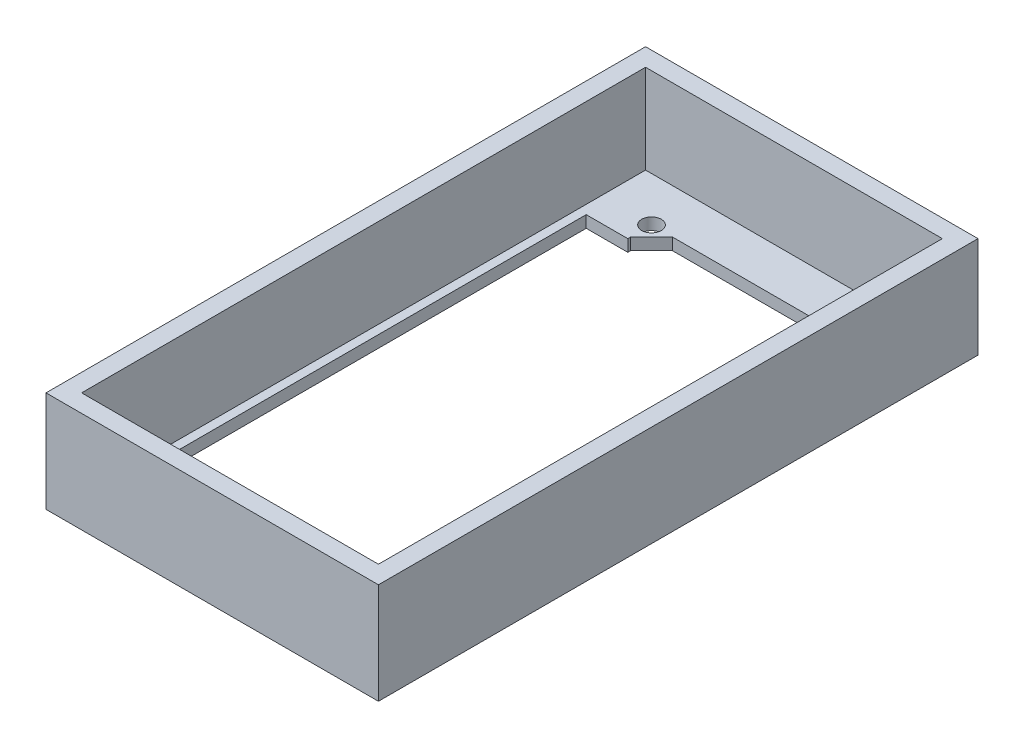
ISO-10303-21;
HEADER;
FILE_DESCRIPTION(('STEP AP214'),'2;1');
FILE_NAME('part.step','',(''),(''),'','','');
FILE_SCHEMA(('AUTOMOTIVE_DESIGN { 1 0 10303 214 1 1 1 1 }'));
ENDSEC;
DATA;
#1=APPLICATION_CONTEXT('core data for automotive mechanical design processes');
#2=APPLICATION_PROTOCOL_DEFINITION('international standard','automotive_design',2000,#1);
#3=PRODUCT_CONTEXT('',#1,'mechanical');
#4=PRODUCT('Part','Part','',(#3));
#5=PRODUCT_RELATED_PRODUCT_CATEGORY('part','',(#4));
#6=PRODUCT_DEFINITION_FORMATION('','',#4);
#7=PRODUCT_DEFINITION_CONTEXT('part definition',#1,'design');
#8=PRODUCT_DEFINITION('design','',#6,#7);
#9=PRODUCT_DEFINITION_SHAPE('','',#8);
#10=(LENGTH_UNIT() NAMED_UNIT(*) SI_UNIT(.MILLI.,.METRE.));
#11=(NAMED_UNIT(*) PLANE_ANGLE_UNIT() SI_UNIT($,.RADIAN.));
#12=(NAMED_UNIT(*) SI_UNIT($,.STERADIAN.) SOLID_ANGLE_UNIT());
#13=UNCERTAINTY_MEASURE_WITH_UNIT(LENGTH_MEASURE(1.E-05),#10,'distance_accuracy_value','');
#14=(GEOMETRIC_REPRESENTATION_CONTEXT(3) GLOBAL_UNCERTAINTY_ASSIGNED_CONTEXT((#13)) GLOBAL_UNIT_ASSIGNED_CONTEXT((#10,
#11,#12)) REPRESENTATION_CONTEXT('',''));
#15=CARTESIAN_POINT('',(0.,0.,0.));
#16=DIRECTION('',(0.,0.,1.));
#17=DIRECTION('',(1.,0.,0.));
#18=AXIS2_PLACEMENT_3D('',#15,#16,#17);
#19=CARTESIAN_POINT('',(-16.5,2.,-36.4644660940673));
#20=DIRECTION('',(1.,0.,0.));
#21=DIRECTION('',(0.,0.,-1.));
#22=AXIS2_PLACEMENT_3D('',#19,#20,#21);
#23=PLANE('',#22);
#24=DIRECTION('',(0.,1.,0.));
#25=VECTOR('',#24,1.);
#26=CARTESIAN_POINT('',(-16.5,0.,-36.));
#27=LINE('',#26,#25);
#28=CARTESIAN_POINT('',(-16.5,0.,-36.));
#29=VERTEX_POINT('',#28);
#30=CARTESIAN_POINT('',(-16.5,2.,-36.));
#31=VERTEX_POINT('',#30);
#32=EDGE_CURVE('E206',#29,#31,#27,.T.);
#33=ORIENTED_EDGE('',*,*,#32,.F.);
#34=DIRECTION('',(0.,0.,1.));
#35=VECTOR('',#34,1.);
#36=CARTESIAN_POINT('',(-16.5,0.,-36.4644660940673));
#37=LINE('',#36,#35);
#38=CARTESIAN_POINT('',(-16.5,0.,-36.4644660940673));
#39=VERTEX_POINT('',#38);
#40=EDGE_CURVE('E198',#39,#29,#37,.T.);
#41=ORIENTED_EDGE('',*,*,#40,.F.);
#42=DIRECTION('',(0.,-1.,0.));
#43=VECTOR('',#42,1.);
#44=CARTESIAN_POINT('',(-16.5,2.,-36.4644660940673));
#45=LINE('',#44,#43);
#46=CARTESIAN_POINT('',(-16.5,2.,-36.4644660940673));
#47=VERTEX_POINT('',#46);
#48=EDGE_CURVE('E296',#47,#39,#45,.T.);
#49=ORIENTED_EDGE('',*,*,#48,.F.);
#50=DIRECTION('',(0.,0.,1.));
#51=VECTOR('',#50,1.);
#52=CARTESIAN_POINT('',(-16.5,2.,-36.4644660940673));
#53=LINE('',#52,#51);
#54=EDGE_CURVE('E269',#47,#31,#53,.T.);
#55=ORIENTED_EDGE('',*,*,#54,.T.);
#56=EDGE_LOOP('',(#33,#41,#49,#55));
#57=FACE_BOUND('',#56,.T.);
#58=ADVANCED_FACE('F35',(#57),#23,.T.);
#59=CARTESIAN_POINT('',(0.,2.,0.));
#60=DIRECTION('',(0.,-1.,0.));
#61=DIRECTION('',(0.,0.,-1.));
#62=AXIS2_PLACEMENT_3D('',#59,#60,#61);
#63=PLANE('',#62);
#64=DIRECTION('',(0.,0.,-1.));
#65=VECTOR('',#64,1.);
#66=CARTESIAN_POINT('',(25.,2.,47.5));
#67=LINE('',#66,#65);
#68=CARTESIAN_POINT('',(25.,2.,47.5));
#69=VERTEX_POINT('',#68);
#70=CARTESIAN_POINT('',(25.,2.,-47.5));
#71=VERTEX_POINT('',#70);
#72=EDGE_CURVE('E215',#69,#71,#67,.T.);
#73=ORIENTED_EDGE('',*,*,#72,.T.);
#74=DIRECTION('',(-1.,0.,0.));
#75=VECTOR('',#74,1.);
#76=CARTESIAN_POINT('',(25.,2.,-47.5));
#77=LINE('',#76,#75);
#78=CARTESIAN_POINT('',(-25.,2.,-47.5));
#79=VERTEX_POINT('',#78);
#80=EDGE_CURVE('E208',#71,#79,#77,.T.);
#81=ORIENTED_EDGE('',*,*,#80,.T.);
#82=DIRECTION('',(0.,0.,1.));
#83=VECTOR('',#82,1.);
#84=CARTESIAN_POINT('',(-25.,2.,-47.5));
#85=LINE('',#84,#83);
#86=CARTESIAN_POINT('',(-25.,2.,47.5));
#87=VERTEX_POINT('',#86);
#88=EDGE_CURVE('E224',#79,#87,#85,.T.);
#89=ORIENTED_EDGE('',*,*,#88,.T.);
#90=DIRECTION('',(1.,0.,0.));
#91=VECTOR('',#90,1.);
#92=CARTESIAN_POINT('',(-25.,2.,47.5));
#93=LINE('',#92,#91);
#94=EDGE_CURVE('E227',#87,#69,#93,.T.);
#95=ORIENTED_EDGE('',*,*,#94,.T.);
#96=EDGE_LOOP('',(#73,#81,#89,#95));
#97=FACE_BOUND('',#96,.T.);
#98=CARTESIAN_POINT('',(16.5,2.,40.));
#99=DIRECTION('',(0.,1.,0.));
#100=DIRECTION('',(0.,0.,1.));
#101=AXIS2_PLACEMENT_3D('',#98,#99,#100);
#102=CIRCLE('',#101,1.65);
#103=CARTESIAN_POINT('',(16.5,2.,41.65));
#104=VERTEX_POINT('',#103);
#105=EDGE_CURVE('E312',#104,#104,#102,.T.);
#106=ORIENTED_EDGE('',*,*,#105,.F.);
#107=EDGE_LOOP('',(#106));
#108=FACE_BOUND('',#107,.T.);
#109=CARTESIAN_POINT('',(-16.5,2.,40.));
#110=DIRECTION('',(0.,1.,0.));
#111=DIRECTION('',(0.,0.,1.));
#112=AXIS2_PLACEMENT_3D('',#109,#110,#111);
#113=CIRCLE('',#112,1.65);
#114=CARTESIAN_POINT('',(-16.5,2.,41.65));
#115=VERTEX_POINT('',#114);
#116=EDGE_CURVE('E318',#115,#115,#113,.T.);
#117=ORIENTED_EDGE('',*,*,#116,.F.);
#118=EDGE_LOOP('',(#117));
#119=FACE_BOUND('',#118,.T.);
#120=CARTESIAN_POINT('',(16.5,2.,-40.));
#121=DIRECTION('',(0.,1.,0.));
#122=DIRECTION('',(0.,0.,1.));
#123=AXIS2_PLACEMENT_3D('',#120,#121,#122);
#124=CIRCLE('',#123,1.65);
#125=CARTESIAN_POINT('',(16.5,2.,-38.35));
#126=VERTEX_POINT('',#125);
#127=EDGE_CURVE('E324',#126,#126,#124,.T.);
#128=ORIENTED_EDGE('',*,*,#127,.F.);
#129=EDGE_LOOP('',(#128));
#130=FACE_BOUND('',#129,.T.);
#131=CARTESIAN_POINT('',(-16.5,2.,-40.));
#132=DIRECTION('',(0.,1.,0.));
#133=DIRECTION('',(0.,0.,1.));
#134=AXIS2_PLACEMENT_3D('',#131,#132,#133);
#135=CIRCLE('',#134,1.65);
#136=CARTESIAN_POINT('',(-16.5,2.,-38.35));
#137=VERTEX_POINT('',#136);
#138=EDGE_CURVE('E330',#137,#137,#135,.T.);
#139=ORIENTED_EDGE('',*,*,#138,.F.);
#140=EDGE_LOOP('',(#139));
#141=FACE_BOUND('',#140,.T.);
#142=DIRECTION('',(0.,0.,1.));
#143=VECTOR('',#142,1.);
#144=CARTESIAN_POINT('',(-23.5,2.,-36.));
#145=LINE('',#144,#143);
#146=CARTESIAN_POINT('',(-23.5,2.,-36.));
#147=VERTEX_POINT('',#146);
#148=CARTESIAN_POINT('',(-23.5,2.,36.));
#149=VERTEX_POINT('',#148);
#150=EDGE_CURVE('E200',#147,#149,#145,.T.);
#151=ORIENTED_EDGE('',*,*,#150,.F.);
#152=DIRECTION('',(-1.,0.,0.));
#153=VECTOR('',#152,1.);
#154=CARTESIAN_POINT('',(-16.5,2.,-36.));
#155=LINE('',#154,#153);
#156=EDGE_CURVE('E179',#31,#147,#155,.T.);
#157=ORIENTED_EDGE('',*,*,#156,.F.);
#158=ORIENTED_EDGE('',*,*,#54,.F.);
#159=DIRECTION('',(-0.707106781186548,0.,0.707106781186547));
#160=VECTOR('',#159,1.);
#161=CARTESIAN_POINT('',(-16.5,2.,-36.4644660940673));
#162=LINE('',#161,#160);
#163=CARTESIAN_POINT('',(-12.9644660940673,2.,-40.));
#164=VERTEX_POINT('',#163);
#165=EDGE_CURVE('E265',#164,#47,#162,.T.);
#166=ORIENTED_EDGE('',*,*,#165,.F.);
#167=DIRECTION('',(-1.,0.,0.));
#168=VECTOR('',#167,1.);
#169=CARTESIAN_POINT('',(-12.9644660940673,2.,-40.));
#170=LINE('',#169,#168);
#171=CARTESIAN_POINT('',(12.9644660940673,2.,-40.));
#172=VERTEX_POINT('',#171);
#173=EDGE_CURVE('E263',#172,#164,#170,.T.);
#174=ORIENTED_EDGE('',*,*,#173,.F.);
#175=DIRECTION('',(-0.707106781186546,0.,-0.707106781186549));
#176=VECTOR('',#175,1.);
#177=CARTESIAN_POINT('',(16.5,2.,-36.4644660940673));
#178=LINE('',#177,#176);
#179=CARTESIAN_POINT('',(16.5,2.,-36.4644660940673));
#180=VERTEX_POINT('',#179);
#181=EDGE_CURVE('E261',#180,#172,#178,.T.);
#182=ORIENTED_EDGE('',*,*,#181,.F.);
#183=DIRECTION('',(0.,0.,-1.));
#184=VECTOR('',#183,1.);
#185=CARTESIAN_POINT('',(16.5,2.,-36.4644660940673));
#186=LINE('',#185,#184);
#187=CARTESIAN_POINT('',(16.5,2.,36.4644660940673));
#188=VERTEX_POINT('',#187);
#189=EDGE_CURVE('E259',#188,#180,#186,.T.);
#190=ORIENTED_EDGE('',*,*,#189,.F.);
#191=DIRECTION('',(0.707106781186552,0.,-0.707106781186543));
#192=VECTOR('',#191,1.);
#193=CARTESIAN_POINT('',(12.9644660940672,2.,40.));
#194=LINE('',#193,#192);
#195=CARTESIAN_POINT('',(12.9644660940672,2.,40.));
#196=VERTEX_POINT('',#195);
#197=EDGE_CURVE('E257',#196,#188,#194,.T.);
#198=ORIENTED_EDGE('',*,*,#197,.F.);
#199=DIRECTION('',(1.,0.,0.));
#200=VECTOR('',#199,1.);
#201=CARTESIAN_POINT('',(-12.9644660940672,2.,40.));
#202=LINE('',#201,#200);
#203=CARTESIAN_POINT('',(-12.9644660940672,2.,40.));
#204=VERTEX_POINT('',#203);
#205=EDGE_CURVE('E255',#204,#196,#202,.T.);
#206=ORIENTED_EDGE('',*,*,#205,.F.);
#207=DIRECTION('',(0.707106781186552,0.,0.707106781186543));
#208=VECTOR('',#207,1.);
#209=CARTESIAN_POINT('',(-12.9644660940672,2.,40.));
#210=LINE('',#209,#208);
#211=CARTESIAN_POINT('',(-16.5,2.,36.4644660940673));
#212=VERTEX_POINT('',#211);
#213=EDGE_CURVE('E253',#212,#204,#210,.T.);
#214=ORIENTED_EDGE('',*,*,#213,.F.);
#215=CARTESIAN_POINT('',(-16.5,2.,36.));
#216=VERTEX_POINT('',#215);
#217=EDGE_CURVE('E268',#216,#212,#53,.T.);
#218=ORIENTED_EDGE('',*,*,#217,.F.);
#219=DIRECTION('',(1.,0.,0.));
#220=VECTOR('',#219,1.);
#221=CARTESIAN_POINT('',(-23.5,2.,36.));
#222=LINE('',#221,#220);
#223=EDGE_CURVE('E50',#149,#216,#222,.T.);
#224=ORIENTED_EDGE('',*,*,#223,.F.);
#225=EDGE_LOOP('',(#151,#157,#158,#166,#174,#182,#190,#198,#206,#214,#218,#224));
#226=FACE_BOUND('',#225,.T.);
#227=ADVANCED_FACE('F376',(#97,#108,#119,#130,#141,#226),#63,.F.);
#228=CARTESIAN_POINT('',(0.,0.,0.));
#229=DIRECTION('',(0.,-1.,0.));
#230=DIRECTION('',(0.,0.,-1.));
#231=AXIS2_PLACEMENT_3D('',#228,#229,#230);
#232=PLANE('',#231);
#233=DIRECTION('',(-1.,0.,0.));
#234=VECTOR('',#233,1.);
#235=CARTESIAN_POINT('',(-16.5,0.,-36.));
#236=LINE('',#235,#234);
#237=CARTESIAN_POINT('',(-23.5,0.,-36.));
#238=VERTEX_POINT('',#237);
#239=EDGE_CURVE('E176',#29,#238,#236,.T.);
#240=ORIENTED_EDGE('',*,*,#239,.T.);
#241=DIRECTION('',(0.,0.,1.));
#242=VECTOR('',#241,1.);
#243=CARTESIAN_POINT('',(-23.5,0.,-36.));
#244=LINE('',#243,#242);
#245=CARTESIAN_POINT('',(-23.5,0.,36.));
#246=VERTEX_POINT('',#245);
#247=EDGE_CURVE('E187',#238,#246,#244,.T.);
#248=ORIENTED_EDGE('',*,*,#247,.T.);
#249=DIRECTION('',(1.,0.,0.));
#250=VECTOR('',#249,1.);
#251=CARTESIAN_POINT('',(-23.5,0.,36.));
#252=LINE('',#251,#250);
#253=CARTESIAN_POINT('',(-16.5,0.,36.));
#254=VERTEX_POINT('',#253);
#255=EDGE_CURVE('E184',#246,#254,#252,.T.);
#256=ORIENTED_EDGE('',*,*,#255,.T.);
#257=CARTESIAN_POINT('',(-16.5,0.,36.4644660940673));
#258=VERTEX_POINT('',#257);
#259=EDGE_CURVE('E292',#254,#258,#37,.T.);
#260=ORIENTED_EDGE('',*,*,#259,.T.);
#261=DIRECTION('',(0.707106781186552,0.,0.707106781186543));
#262=VECTOR('',#261,1.);
#263=CARTESIAN_POINT('',(-12.9644660940672,0.,40.));
#264=LINE('',#263,#262);
#265=CARTESIAN_POINT('',(-12.9644660940672,0.,40.));
#266=VERTEX_POINT('',#265);
#267=EDGE_CURVE('E252',#258,#266,#264,.T.);
#268=ORIENTED_EDGE('',*,*,#267,.T.);
#269=DIRECTION('',(1.,0.,0.));
#270=VECTOR('',#269,1.);
#271=CARTESIAN_POINT('',(-12.9644660940672,0.,40.));
#272=LINE('',#271,#270);
#273=CARTESIAN_POINT('',(12.9644660940672,0.,40.));
#274=VERTEX_POINT('',#273);
#275=EDGE_CURVE('E275',#266,#274,#272,.T.);
#276=ORIENTED_EDGE('',*,*,#275,.T.);
#277=DIRECTION('',(0.707106781186552,0.,-0.707106781186543));
#278=VECTOR('',#277,1.);
#279=CARTESIAN_POINT('',(12.9644660940672,0.,40.));
#280=LINE('',#279,#278);
#281=CARTESIAN_POINT('',(16.5,0.,36.4644660940673));
#282=VERTEX_POINT('',#281);
#283=EDGE_CURVE('E278',#274,#282,#280,.T.);
#284=ORIENTED_EDGE('',*,*,#283,.T.);
#285=DIRECTION('',(0.,0.,-1.));
#286=VECTOR('',#285,1.);
#287=CARTESIAN_POINT('',(16.5,0.,-36.4644660940673));
#288=LINE('',#287,#286);
#289=CARTESIAN_POINT('',(16.5,0.,-36.4644660940673));
#290=VERTEX_POINT('',#289);
#291=EDGE_CURVE('E281',#282,#290,#288,.T.);
#292=ORIENTED_EDGE('',*,*,#291,.T.);
#293=DIRECTION('',(-0.707106781186546,0.,-0.707106781186549));
#294=VECTOR('',#293,1.);
#295=CARTESIAN_POINT('',(16.5,0.,-36.4644660940673));
#296=LINE('',#295,#294);
#297=CARTESIAN_POINT('',(12.9644660940673,0.,-40.));
#298=VERTEX_POINT('',#297);
#299=EDGE_CURVE('E284',#290,#298,#296,.T.);
#300=ORIENTED_EDGE('',*,*,#299,.T.);
#301=DIRECTION('',(-1.,0.,0.));
#302=VECTOR('',#301,1.);
#303=CARTESIAN_POINT('',(-12.9644660940673,0.,-40.));
#304=LINE('',#303,#302);
#305=CARTESIAN_POINT('',(-12.9644660940673,0.,-40.));
#306=VERTEX_POINT('',#305);
#307=EDGE_CURVE('E287',#298,#306,#304,.T.);
#308=ORIENTED_EDGE('',*,*,#307,.T.);
#309=DIRECTION('',(-0.707106781186548,0.,0.707106781186547));
#310=VECTOR('',#309,1.);
#311=CARTESIAN_POINT('',(-16.5,0.,-36.4644660940673));
#312=LINE('',#311,#310);
#313=EDGE_CURVE('E290',#306,#39,#312,.T.);
#314=ORIENTED_EDGE('',*,*,#313,.T.);
#315=ORIENTED_EDGE('',*,*,#40,.T.);
#316=EDGE_LOOP('',(#240,#248,#256,#260,#268,#276,#284,#292,#300,#308,#314,#315));
#317=FACE_BOUND('',#316,.T.);
#318=CARTESIAN_POINT('',(-16.5,0.,40.));
#319=DIRECTION('',(0.,1.,0.));
#320=DIRECTION('',(0.,0.,1.));
#321=AXIS2_PLACEMENT_3D('',#318,#319,#320);
#322=CIRCLE('',#321,1.65);
#323=CARTESIAN_POINT('',(-16.5,0.,41.65));
#324=VERTEX_POINT('',#323);
#325=EDGE_CURVE('E315',#324,#324,#322,.T.);
#326=ORIENTED_EDGE('',*,*,#325,.T.);
#327=EDGE_LOOP('',(#326));
#328=FACE_BOUND('',#327,.T.);
#329=CARTESIAN_POINT('',(-16.5,0.,-40.));
#330=DIRECTION('',(0.,1.,0.));
#331=DIRECTION('',(0.,0.,1.));
#332=AXIS2_PLACEMENT_3D('',#329,#330,#331);
#333=CIRCLE('',#332,1.65);
#334=CARTESIAN_POINT('',(-16.5,0.,-38.35));
#335=VERTEX_POINT('',#334);
#336=EDGE_CURVE('E327',#335,#335,#333,.T.);
#337=ORIENTED_EDGE('',*,*,#336,.T.);
#338=EDGE_LOOP('',(#337));
#339=FACE_BOUND('',#338,.T.);
#340=DIRECTION('',(-1.,0.,0.));
#341=VECTOR('',#340,1.);
#342=CARTESIAN_POINT('',(-28.,0.,-50.5));
#343=LINE('',#342,#341);
#344=CARTESIAN_POINT('',(28.,0.,-50.5));
#345=VERTEX_POINT('',#344);
#346=CARTESIAN_POINT('',(-28.,0.,-50.5));
#347=VERTEX_POINT('',#346);
#348=EDGE_CURVE('E333',#345,#347,#343,.T.);
#349=ORIENTED_EDGE('',*,*,#348,.F.);
#350=DIRECTION('',(0.,0.,-1.));
#351=VECTOR('',#350,1.);
#352=CARTESIAN_POINT('',(28.,0.,-50.5));
#353=LINE('',#352,#351);
#354=CARTESIAN_POINT('',(28.,0.,50.5));
#355=VERTEX_POINT('',#354);
#356=EDGE_CURVE('E342',#355,#345,#353,.T.);
#357=ORIENTED_EDGE('',*,*,#356,.F.);
#358=DIRECTION('',(1.,0.,0.));
#359=VECTOR('',#358,1.);
#360=CARTESIAN_POINT('',(-28.,0.,50.5));
#361=LINE('',#360,#359);
#362=CARTESIAN_POINT('',(-28.,0.,50.5));
#363=VERTEX_POINT('',#362);
#364=EDGE_CURVE('E340',#363,#355,#361,.T.);
#365=ORIENTED_EDGE('',*,*,#364,.F.);
#366=DIRECTION('',(0.,0.,1.));
#367=VECTOR('',#366,1.);
#368=CARTESIAN_POINT('',(-28.,0.,-50.5));
#369=LINE('',#368,#367);
#370=EDGE_CURVE('E338',#347,#363,#369,.T.);
#371=ORIENTED_EDGE('',*,*,#370,.F.);
#372=EDGE_LOOP('',(#349,#357,#365,#371));
#373=FACE_BOUND('',#372,.T.);
#374=CARTESIAN_POINT('',(16.5,0.,-40.));
#375=DIRECTION('',(0.,1.,0.));
#376=DIRECTION('',(0.,0.,1.));
#377=AXIS2_PLACEMENT_3D('',#374,#375,#376);
#378=CIRCLE('',#377,1.65);
#379=CARTESIAN_POINT('',(16.5,0.,-38.35));
#380=VERTEX_POINT('',#379);
#381=EDGE_CURVE('E321',#380,#380,#378,.T.);
#382=ORIENTED_EDGE('',*,*,#381,.T.);
#383=EDGE_LOOP('',(#382));
#384=FACE_BOUND('',#383,.T.);
#385=CARTESIAN_POINT('',(16.5,0.,40.));
#386=DIRECTION('',(0.,1.,0.));
#387=DIRECTION('',(0.,0.,1.));
#388=AXIS2_PLACEMENT_3D('',#385,#386,#387);
#389=CIRCLE('',#388,1.65);
#390=CARTESIAN_POINT('',(16.5,0.,41.65));
#391=VERTEX_POINT('',#390);
#392=EDGE_CURVE('E311',#391,#391,#389,.T.);
#393=ORIENTED_EDGE('',*,*,#392,.T.);
#394=EDGE_LOOP('',(#393));
#395=FACE_BOUND('',#394,.T.);
#396=ADVANCED_FACE('F194',(#317,#328,#339,#373,#384,#395),#232,.T.);
#397=CARTESIAN_POINT('',(-28.,2.,-50.5));
#398=DIRECTION('',(0.,0.,1.));
#399=DIRECTION('',(1.,0.,0.));
#400=AXIS2_PLACEMENT_3D('',#397,#398,#399);
#401=PLANE('',#400);
#402=ORIENTED_EDGE('',*,*,#348,.T.);
#403=DIRECTION('',(0.,-1.,0.));
#404=VECTOR('',#403,1.);
#405=CARTESIAN_POINT('',(-28.,2.,-50.5));
#406=LINE('',#405,#404);
#407=CARTESIAN_POINT('',(-28.,17.,-50.5));
#408=VERTEX_POINT('',#407);
#409=EDGE_CURVE('E11',#408,#347,#406,.T.);
#410=ORIENTED_EDGE('',*,*,#409,.F.);
#411=DIRECTION('',(-1.,0.,0.));
#412=VECTOR('',#411,1.);
#413=CARTESIAN_POINT('',(28.,17.,-50.5));
#414=LINE('',#413,#412);
#415=CARTESIAN_POINT('',(28.,17.,-50.5));
#416=VERTEX_POINT('',#415);
#417=EDGE_CURVE('E240',#416,#408,#414,.T.);
#418=ORIENTED_EDGE('',*,*,#417,.F.);
#419=DIRECTION('',(0.,-1.,0.));
#420=VECTOR('',#419,1.);
#421=CARTESIAN_POINT('',(28.,2.,-50.5));
#422=LINE('',#421,#420);
#423=EDGE_CURVE('E344',#416,#345,#422,.T.);
#424=ORIENTED_EDGE('',*,*,#423,.T.);
#425=EDGE_LOOP('',(#402,#410,#418,#424));
#426=FACE_BOUND('',#425,.T.);
#427=ADVANCED_FACE('F37',(#426),#401,.F.);
#428=CARTESIAN_POINT('',(-28.,2.,-50.5));
#429=DIRECTION('',(1.,0.,0.));
#430=DIRECTION('',(0.,0.,-1.));
#431=AXIS2_PLACEMENT_3D('',#428,#429,#430);
#432=PLANE('',#431);
#433=ORIENTED_EDGE('',*,*,#370,.T.);
#434=DIRECTION('',(0.,-1.,0.));
#435=VECTOR('',#434,1.);
#436=CARTESIAN_POINT('',(-28.,2.,50.5));
#437=LINE('',#436,#435);
#438=CARTESIAN_POINT('',(-28.,17.,50.5));
#439=VERTEX_POINT('',#438);
#440=EDGE_CURVE('E43',#439,#363,#437,.T.);
#441=ORIENTED_EDGE('',*,*,#440,.F.);
#442=DIRECTION('',(0.,0.,1.));
#443=VECTOR('',#442,1.);
#444=CARTESIAN_POINT('',(-28.,17.,-50.5));
#445=LINE('',#444,#443);
#446=EDGE_CURVE('E243',#408,#439,#445,.T.);
#447=ORIENTED_EDGE('',*,*,#446,.F.);
#448=ORIENTED_EDGE('',*,*,#409,.T.);
#449=EDGE_LOOP('',(#433,#441,#447,#448));
#450=FACE_BOUND('',#449,.T.);
#451=ADVANCED_FACE('F368',(#450),#432,.F.);
#452=CARTESIAN_POINT('',(-28.,2.,50.5));
#453=DIRECTION('',(0.,0.,-1.));
#454=DIRECTION('',(-1.,0.,0.));
#455=AXIS2_PLACEMENT_3D('',#452,#453,#454);
#456=PLANE('',#455);
#457=ORIENTED_EDGE('',*,*,#364,.T.);
#458=DIRECTION('',(0.,-1.,0.));
#459=VECTOR('',#458,1.);
#460=CARTESIAN_POINT('',(28.,2.,50.5));
#461=LINE('',#460,#459);
#462=CARTESIAN_POINT('',(28.,17.,50.5));
#463=VERTEX_POINT('',#462);
#464=EDGE_CURVE('E347',#463,#355,#461,.T.);
#465=ORIENTED_EDGE('',*,*,#464,.F.);
#466=DIRECTION('',(1.,0.,0.));
#467=VECTOR('',#466,1.);
#468=CARTESIAN_POINT('',(-28.,17.,50.5));
#469=LINE('',#468,#467);
#470=EDGE_CURVE('E246',#439,#463,#469,.T.);
#471=ORIENTED_EDGE('',*,*,#470,.F.);
#472=ORIENTED_EDGE('',*,*,#440,.T.);
#473=EDGE_LOOP('',(#457,#465,#471,#472));
#474=FACE_BOUND('',#473,.T.);
#475=ADVANCED_FACE('F353',(#474),#456,.F.);
#476=CARTESIAN_POINT('',(28.,2.,-50.5));
#477=DIRECTION('',(-1.,0.,0.));
#478=DIRECTION('',(0.,0.,1.));
#479=AXIS2_PLACEMENT_3D('',#476,#477,#478);
#480=PLANE('',#479);
#481=ORIENTED_EDGE('',*,*,#356,.T.);
#482=ORIENTED_EDGE('',*,*,#423,.F.);
#483=DIRECTION('',(0.,0.,-1.));
#484=VECTOR('',#483,1.);
#485=CARTESIAN_POINT('',(28.,17.,50.5));
#486=LINE('',#485,#484);
#487=EDGE_CURVE('E249',#463,#416,#486,.T.);
#488=ORIENTED_EDGE('',*,*,#487,.F.);
#489=ORIENTED_EDGE('',*,*,#464,.T.);
#490=EDGE_LOOP('',(#481,#482,#488,#489));
#491=FACE_BOUND('',#490,.T.);
#492=ADVANCED_FACE('F361',(#491),#480,.F.);
#493=CARTESIAN_POINT('',(-16.5,2.,-40.));
#494=DIRECTION('',(0.,-1.,0.));
#495=DIRECTION('',(0.,0.,-1.));
#496=AXIS2_PLACEMENT_3D('',#493,#494,#495);
#497=CYLINDRICAL_SURFACE('',#496,1.65);
#498=ORIENTED_EDGE('',*,*,#138,.T.);
#499=EDGE_LOOP('',(#498));
#500=FACE_BOUND('',#499,.T.);
#501=ORIENTED_EDGE('',*,*,#336,.F.);
#502=EDGE_LOOP('',(#501));
#503=FACE_BOUND('',#502,.T.);
#504=ADVANCED_FACE('F456',(#500,#503),#497,.F.);
#505=CARTESIAN_POINT('',(16.5,2.,-40.));
#506=DIRECTION('',(0.,-1.,0.));
#507=DIRECTION('',(0.,0.,-1.));
#508=AXIS2_PLACEMENT_3D('',#505,#506,#507);
#509=CYLINDRICAL_SURFACE('',#508,1.65);
#510=ORIENTED_EDGE('',*,*,#127,.T.);
#511=EDGE_LOOP('',(#510));
#512=FACE_BOUND('',#511,.T.);
#513=ORIENTED_EDGE('',*,*,#381,.F.);
#514=EDGE_LOOP('',(#513));
#515=FACE_BOUND('',#514,.T.);
#516=ADVANCED_FACE('F452',(#512,#515),#509,.F.);
#517=CARTESIAN_POINT('',(-16.5,2.,40.));
#518=DIRECTION('',(0.,-1.,0.));
#519=DIRECTION('',(0.,0.,-1.));
#520=AXIS2_PLACEMENT_3D('',#517,#518,#519);
#521=CYLINDRICAL_SURFACE('',#520,1.65);
#522=ORIENTED_EDGE('',*,*,#116,.T.);
#523=EDGE_LOOP('',(#522));
#524=FACE_BOUND('',#523,.T.);
#525=ORIENTED_EDGE('',*,*,#325,.F.);
#526=EDGE_LOOP('',(#525));
#527=FACE_BOUND('',#526,.T.);
#528=ADVANCED_FACE('F448',(#524,#527),#521,.F.);
#529=CARTESIAN_POINT('',(16.5,2.,40.));
#530=DIRECTION('',(0.,-1.,0.));
#531=DIRECTION('',(0.,0.,-1.));
#532=AXIS2_PLACEMENT_3D('',#529,#530,#531);
#533=CYLINDRICAL_SURFACE('',#532,1.65);
#534=ORIENTED_EDGE('',*,*,#105,.T.);
#535=EDGE_LOOP('',(#534));
#536=FACE_BOUND('',#535,.T.);
#537=ORIENTED_EDGE('',*,*,#392,.F.);
#538=EDGE_LOOP('',(#537));
#539=FACE_BOUND('',#538,.T.);
#540=ADVANCED_FACE('F445',(#536,#539),#533,.F.);
#541=CARTESIAN_POINT('',(-12.9644660940672,2.,40.));
#542=DIRECTION('',(0.707106781186543,0.,-0.707106781186552));
#543=DIRECTION('',(-0.707106781186552,0.,-0.707106781186543));
#544=AXIS2_PLACEMENT_3D('',#541,#542,#543);
#545=PLANE('',#544);
#546=ORIENTED_EDGE('',*,*,#267,.F.);
#547=DIRECTION('',(0.,-1.,0.));
#548=VECTOR('',#547,1.);
#549=CARTESIAN_POINT('',(-16.5,2.,36.4644660940673));
#550=LINE('',#549,#548);
#551=EDGE_CURVE('E272',#212,#258,#550,.T.);
#552=ORIENTED_EDGE('',*,*,#551,.F.);
#553=ORIENTED_EDGE('',*,*,#213,.T.);
#554=DIRECTION('',(0.,-1.,0.));
#555=VECTOR('',#554,1.);
#556=CARTESIAN_POINT('',(-12.9644660940672,2.,40.));
#557=LINE('',#556,#555);
#558=EDGE_CURVE('E308',#204,#266,#557,.T.);
#559=ORIENTED_EDGE('',*,*,#558,.T.);
#560=EDGE_LOOP('',(#546,#552,#553,#559));
#561=FACE_BOUND('',#560,.T.);
#562=ADVANCED_FACE('F407',(#561),#545,.T.);
#563=CARTESIAN_POINT('',(-12.9644660940672,2.,40.));
#564=DIRECTION('',(0.,0.,-1.));
#565=DIRECTION('',(-1.,0.,0.));
#566=AXIS2_PLACEMENT_3D('',#563,#564,#565);
#567=PLANE('',#566);
#568=ORIENTED_EDGE('',*,*,#275,.F.);
#569=ORIENTED_EDGE('',*,*,#558,.F.);
#570=ORIENTED_EDGE('',*,*,#205,.T.);
#571=DIRECTION('',(0.,-1.,0.));
#572=VECTOR('',#571,1.);
#573=CARTESIAN_POINT('',(12.9644660940672,2.,40.));
#574=LINE('',#573,#572);
#575=EDGE_CURVE('E306',#196,#274,#574,.T.);
#576=ORIENTED_EDGE('',*,*,#575,.T.);
#577=EDGE_LOOP('',(#568,#569,#570,#576));
#578=FACE_BOUND('',#577,.T.);
#579=ADVANCED_FACE('F409',(#578),#567,.T.);
#580=CARTESIAN_POINT('',(12.9644660940672,2.,40.));
#581=DIRECTION('',(-0.707106781186543,0.,-0.707106781186552));
#582=DIRECTION('',(-0.707106781186552,0.,0.707106781186543));
#583=AXIS2_PLACEMENT_3D('',#580,#581,#582);
#584=PLANE('',#583);
#585=ORIENTED_EDGE('',*,*,#283,.F.);
#586=ORIENTED_EDGE('',*,*,#575,.F.);
#587=ORIENTED_EDGE('',*,*,#197,.T.);
#588=DIRECTION('',(0.,-1.,0.));
#589=VECTOR('',#588,1.);
#590=CARTESIAN_POINT('',(16.5,2.,36.4644660940673));
#591=LINE('',#590,#589);
#592=EDGE_CURVE('E304',#188,#282,#591,.T.);
#593=ORIENTED_EDGE('',*,*,#592,.T.);
#594=EDGE_LOOP('',(#585,#586,#587,#593));
#595=FACE_BOUND('',#594,.T.);
#596=ADVANCED_FACE('F432',(#595),#584,.T.);
#597=CARTESIAN_POINT('',(16.5,2.,-36.4644660940673));
#598=DIRECTION('',(-1.,0.,0.));
#599=DIRECTION('',(0.,0.,1.));
#600=AXIS2_PLACEMENT_3D('',#597,#598,#599);
#601=PLANE('',#600);
#602=ORIENTED_EDGE('',*,*,#291,.F.);
#603=ORIENTED_EDGE('',*,*,#592,.F.);
#604=ORIENTED_EDGE('',*,*,#189,.T.);
#605=DIRECTION('',(0.,-1.,0.));
#606=VECTOR('',#605,1.);
#607=CARTESIAN_POINT('',(16.5,2.,-36.4644660940673));
#608=LINE('',#607,#606);
#609=EDGE_CURVE('E302',#180,#290,#608,.T.);
#610=ORIENTED_EDGE('',*,*,#609,.T.);
#611=EDGE_LOOP('',(#602,#603,#604,#610));
#612=FACE_BOUND('',#611,.T.);
#613=ADVANCED_FACE('F429',(#612),#601,.T.);
#614=CARTESIAN_POINT('',(16.5,2.,-36.4644660940673));
#615=DIRECTION('',(-0.707106781186549,0.,0.707106781186546));
#616=DIRECTION('',(0.707106781186546,0.,0.707106781186549));
#617=AXIS2_PLACEMENT_3D('',#614,#615,#616);
#618=PLANE('',#617);
#619=ORIENTED_EDGE('',*,*,#299,.F.);
#620=ORIENTED_EDGE('',*,*,#609,.F.);
#621=ORIENTED_EDGE('',*,*,#181,.T.);
#622=DIRECTION('',(0.,-1.,0.));
#623=VECTOR('',#622,1.);
#624=CARTESIAN_POINT('',(12.9644660940673,2.,-40.));
#625=LINE('',#624,#623);
#626=EDGE_CURVE('E300',#172,#298,#625,.T.);
#627=ORIENTED_EDGE('',*,*,#626,.T.);
#628=EDGE_LOOP('',(#619,#620,#621,#627));
#629=FACE_BOUND('',#628,.T.);
#630=ADVANCED_FACE('F425',(#629),#618,.T.);
#631=CARTESIAN_POINT('',(-12.9644660940673,2.,-40.));
#632=DIRECTION('',(0.,0.,1.));
#633=DIRECTION('',(1.,0.,0.));
#634=AXIS2_PLACEMENT_3D('',#631,#632,#633);
#635=PLANE('',#634);
#636=ORIENTED_EDGE('',*,*,#307,.F.);
#637=ORIENTED_EDGE('',*,*,#626,.F.);
#638=ORIENTED_EDGE('',*,*,#173,.T.);
#639=DIRECTION('',(0.,-1.,0.));
#640=VECTOR('',#639,1.);
#641=CARTESIAN_POINT('',(-12.9644660940673,2.,-40.));
#642=LINE('',#641,#640);
#643=EDGE_CURVE('E298',#164,#306,#642,.T.);
#644=ORIENTED_EDGE('',*,*,#643,.T.);
#645=EDGE_LOOP('',(#636,#637,#638,#644));
#646=FACE_BOUND('',#645,.T.);
#647=ADVANCED_FACE('F395',(#646),#635,.T.);
#648=CARTESIAN_POINT('',(-16.5,2.,-36.4644660940673));
#649=DIRECTION('',(0.707106781186547,0.,0.707106781186548));
#650=DIRECTION('',(0.707106781186548,0.,-0.707106781186547));
#651=AXIS2_PLACEMENT_3D('',#648,#649,#650);
#652=PLANE('',#651);
#653=ORIENTED_EDGE('',*,*,#313,.F.);
#654=ORIENTED_EDGE('',*,*,#643,.F.);
#655=ORIENTED_EDGE('',*,*,#165,.T.);
#656=ORIENTED_EDGE('',*,*,#48,.T.);
#657=EDGE_LOOP('',(#653,#654,#655,#656));
#658=FACE_BOUND('',#657,.T.);
#659=ADVANCED_FACE('F388',(#658),#652,.T.);
#660=DIRECTION('',(0.,1.,0.));
#661=VECTOR('',#660,1.);
#662=CARTESIAN_POINT('',(-16.5,0.,36.));
#663=LINE('',#662,#661);
#664=EDGE_CURVE('E209',#254,#216,#663,.T.);
#665=ORIENTED_EDGE('',*,*,#664,.T.);
#666=ORIENTED_EDGE('',*,*,#217,.T.);
#667=ORIENTED_EDGE('',*,*,#551,.T.);
#668=ORIENTED_EDGE('',*,*,#259,.F.);
#669=EDGE_LOOP('',(#665,#666,#667,#668));
#670=FACE_BOUND('',#669,.T.);
#671=ADVANCED_FACE('F379',(#670),#23,.T.);
#672=CARTESIAN_POINT('',(0.,17.,0.));
#673=DIRECTION('',(0.,1.,0.));
#674=DIRECTION('',(0.,0.,1.));
#675=AXIS2_PLACEMENT_3D('',#672,#673,#674);
#676=PLANE('',#675);
#677=ORIENTED_EDGE('',*,*,#417,.T.);
#678=ORIENTED_EDGE('',*,*,#446,.T.);
#679=ORIENTED_EDGE('',*,*,#470,.T.);
#680=ORIENTED_EDGE('',*,*,#487,.T.);
#681=EDGE_LOOP('',(#677,#678,#679,#680));
#682=FACE_BOUND('',#681,.T.);
#683=DIRECTION('',(0.,0.,1.));
#684=VECTOR('',#683,1.);
#685=CARTESIAN_POINT('',(-25.,17.,-47.5));
#686=LINE('',#685,#684);
#687=CARTESIAN_POINT('',(-25.,17.,-47.5));
#688=VERTEX_POINT('',#687);
#689=CARTESIAN_POINT('',(-25.,17.,47.5));
#690=VERTEX_POINT('',#689);
#691=EDGE_CURVE('E214',#688,#690,#686,.T.);
#692=ORIENTED_EDGE('',*,*,#691,.F.);
#693=DIRECTION('',(-1.,0.,0.));
#694=VECTOR('',#693,1.);
#695=CARTESIAN_POINT('',(25.,17.,-47.5));
#696=LINE('',#695,#694);
#697=CARTESIAN_POINT('',(25.,17.,-47.5));
#698=VERTEX_POINT('',#697);
#699=EDGE_CURVE('E212',#698,#688,#696,.T.);
#700=ORIENTED_EDGE('',*,*,#699,.F.);
#701=DIRECTION('',(0.,0.,-1.));
#702=VECTOR('',#701,1.);
#703=CARTESIAN_POINT('',(25.,17.,47.5));
#704=LINE('',#703,#702);
#705=CARTESIAN_POINT('',(25.,17.,47.5));
#706=VERTEX_POINT('',#705);
#707=EDGE_CURVE('E220',#706,#698,#704,.T.);
#708=ORIENTED_EDGE('',*,*,#707,.F.);
#709=DIRECTION('',(1.,0.,0.));
#710=VECTOR('',#709,1.);
#711=CARTESIAN_POINT('',(-25.,17.,47.5));
#712=LINE('',#711,#710);
#713=EDGE_CURVE('E217',#690,#706,#712,.T.);
#714=ORIENTED_EDGE('',*,*,#713,.F.);
#715=EDGE_LOOP('',(#692,#700,#708,#714));
#716=FACE_BOUND('',#715,.T.);
#717=ADVANCED_FACE('F366',(#682,#716),#676,.T.);
#718=CARTESIAN_POINT('',(25.,17.,-47.5));
#719=DIRECTION('',(0.,0.,1.));
#720=DIRECTION('',(1.,0.,0.));
#721=AXIS2_PLACEMENT_3D('',#718,#719,#720);
#722=PLANE('',#721);
#723=ORIENTED_EDGE('',*,*,#80,.F.);
#724=DIRECTION('',(0.,-1.,0.));
#725=VECTOR('',#724,1.);
#726=CARTESIAN_POINT('',(25.,17.,-47.5));
#727=LINE('',#726,#725);
#728=EDGE_CURVE('E58',#698,#71,#727,.T.);
#729=ORIENTED_EDGE('',*,*,#728,.F.);
#730=ORIENTED_EDGE('',*,*,#699,.T.);
#731=DIRECTION('',(0.,-1.,0.));
#732=VECTOR('',#731,1.);
#733=CARTESIAN_POINT('',(-25.,17.,-47.5));
#734=LINE('',#733,#732);
#735=EDGE_CURVE('E237',#688,#79,#734,.T.);
#736=ORIENTED_EDGE('',*,*,#735,.T.);
#737=EDGE_LOOP('',(#723,#729,#730,#736));
#738=FACE_BOUND('',#737,.T.);
#739=ADVANCED_FACE('F394',(#738),#722,.T.);
#740=CARTESIAN_POINT('',(-25.,17.,-47.5));
#741=DIRECTION('',(1.,0.,0.));
#742=DIRECTION('',(0.,0.,-1.));
#743=AXIS2_PLACEMENT_3D('',#740,#741,#742);
#744=PLANE('',#743);
#745=ORIENTED_EDGE('',*,*,#88,.F.);
#746=ORIENTED_EDGE('',*,*,#735,.F.);
#747=ORIENTED_EDGE('',*,*,#691,.T.);
#748=DIRECTION('',(0.,-1.,0.));
#749=VECTOR('',#748,1.);
#750=CARTESIAN_POINT('',(-25.,17.,47.5));
#751=LINE('',#750,#749);
#752=EDGE_CURVE('E235',#690,#87,#751,.T.);
#753=ORIENTED_EDGE('',*,*,#752,.T.);
#754=EDGE_LOOP('',(#745,#746,#747,#753));
#755=FACE_BOUND('',#754,.T.);
#756=ADVANCED_FACE('F563',(#755),#744,.T.);
#757=CARTESIAN_POINT('',(-25.,17.,47.5));
#758=DIRECTION('',(0.,0.,-1.));
#759=DIRECTION('',(-1.,0.,0.));
#760=AXIS2_PLACEMENT_3D('',#757,#758,#759);
#761=PLANE('',#760);
#762=ORIENTED_EDGE('',*,*,#94,.F.);
#763=ORIENTED_EDGE('',*,*,#752,.F.);
#764=ORIENTED_EDGE('',*,*,#713,.T.);
#765=DIRECTION('',(0.,-1.,0.));
#766=VECTOR('',#765,1.);
#767=CARTESIAN_POINT('',(25.,17.,47.5));
#768=LINE('',#767,#766);
#769=EDGE_CURVE('E233',#706,#69,#768,.T.);
#770=ORIENTED_EDGE('',*,*,#769,.T.);
#771=EDGE_LOOP('',(#762,#763,#764,#770));
#772=FACE_BOUND('',#771,.T.);
#773=ADVANCED_FACE('F572',(#772),#761,.T.);
#774=CARTESIAN_POINT('',(25.,17.,47.5));
#775=DIRECTION('',(-1.,0.,0.));
#776=DIRECTION('',(0.,0.,1.));
#777=AXIS2_PLACEMENT_3D('',#774,#775,#776);
#778=PLANE('',#777);
#779=ORIENTED_EDGE('',*,*,#72,.F.);
#780=ORIENTED_EDGE('',*,*,#769,.F.);
#781=ORIENTED_EDGE('',*,*,#707,.T.);
#782=ORIENTED_EDGE('',*,*,#728,.T.);
#783=EDGE_LOOP('',(#779,#780,#781,#782));
#784=FACE_BOUND('',#783,.T.);
#785=ADVANCED_FACE('F581',(#784),#778,.T.);
#786=CARTESIAN_POINT('',(-16.5,0.,-36.));
#787=DIRECTION('',(0.,0.,-1.));
#788=DIRECTION('',(-1.,0.,0.));
#789=AXIS2_PLACEMENT_3D('',#786,#787,#788);
#790=PLANE('',#789);
#791=ORIENTED_EDGE('',*,*,#156,.T.);
#792=DIRECTION('',(0.,1.,0.));
#793=VECTOR('',#792,1.);
#794=CARTESIAN_POINT('',(-23.5,0.,-36.));
#795=LINE('',#794,#793);
#796=EDGE_CURVE('E172',#238,#147,#795,.T.);
#797=ORIENTED_EDGE('',*,*,#796,.F.);
#798=ORIENTED_EDGE('',*,*,#239,.F.);
#799=ORIENTED_EDGE('',*,*,#32,.T.);
#800=EDGE_LOOP('',(#791,#797,#798,#799));
#801=FACE_BOUND('',#800,.T.);
#802=ADVANCED_FACE('F174',(#801),#790,.F.);
#803=CARTESIAN_POINT('',(-23.5,0.,36.));
#804=DIRECTION('',(0.,0.,1.));
#805=DIRECTION('',(1.,0.,0.));
#806=AXIS2_PLACEMENT_3D('',#803,#804,#805);
#807=PLANE('',#806);
#808=ORIENTED_EDGE('',*,*,#223,.T.);
#809=ORIENTED_EDGE('',*,*,#664,.F.);
#810=ORIENTED_EDGE('',*,*,#255,.F.);
#811=DIRECTION('',(0.,1.,0.));
#812=VECTOR('',#811,1.);
#813=CARTESIAN_POINT('',(-23.5,0.,36.));
#814=LINE('',#813,#812);
#815=EDGE_CURVE('E183',#246,#149,#814,.T.);
#816=ORIENTED_EDGE('',*,*,#815,.T.);
#817=EDGE_LOOP('',(#808,#809,#810,#816));
#818=FACE_BOUND('',#817,.T.);
#819=ADVANCED_FACE('F412',(#818),#807,.F.);
#820=CARTESIAN_POINT('',(-23.5,0.,-36.));
#821=DIRECTION('',(-1.,0.,0.));
#822=DIRECTION('',(0.,0.,1.));
#823=AXIS2_PLACEMENT_3D('',#820,#821,#822);
#824=PLANE('',#823);
#825=ORIENTED_EDGE('',*,*,#150,.T.);
#826=ORIENTED_EDGE('',*,*,#815,.F.);
#827=ORIENTED_EDGE('',*,*,#247,.F.);
#828=ORIENTED_EDGE('',*,*,#796,.T.);
#829=EDGE_LOOP('',(#825,#826,#827,#828));
#830=FACE_BOUND('',#829,.T.);
#831=ADVANCED_FACE('F188',(#830),#824,.F.);
#832=CLOSED_SHELL('',(#58,#227,#396,#427,#451,#475,#492,#504,#516,#528,#540,#562,#579,#596,#613,
#630,#647,#659,#671,#717,#739,#756,#773,#785,#802,#819,#831));
#833=MANIFOLD_SOLID_BREP('B2',#832);
#834=ADVANCED_BREP_SHAPE_REPRESENTATION('',(#18,#833),#14);
#835=SHAPE_DEFINITION_REPRESENTATION(#9,#834);
ENDSEC;
END-ISO-10303-21;
